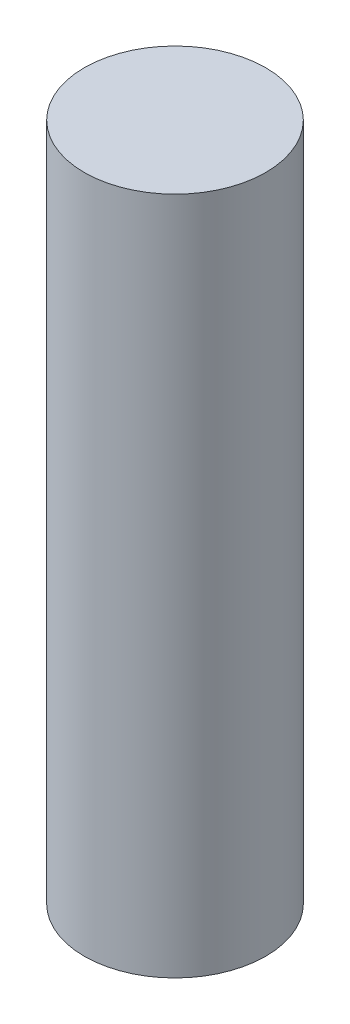
ISO-10303-21;
HEADER;
FILE_DESCRIPTION(('STEP AP214'),'2;1');
FILE_NAME('part.step','',(''),(''),'','','');
FILE_SCHEMA(('AUTOMOTIVE_DESIGN { 1 0 10303 214 1 1 1 1 }'));
ENDSEC;
DATA;
#1=APPLICATION_CONTEXT('core data for automotive mechanical design processes');
#2=APPLICATION_PROTOCOL_DEFINITION('international standard','automotive_design',2000,#1);
#3=PRODUCT_CONTEXT('',#1,'mechanical');
#4=PRODUCT('Part','Part','',(#3));
#5=PRODUCT_RELATED_PRODUCT_CATEGORY('part','',(#4));
#6=PRODUCT_DEFINITION_FORMATION('','',#4);
#7=PRODUCT_DEFINITION_CONTEXT('part definition',#1,'design');
#8=PRODUCT_DEFINITION('design','',#6,#7);
#9=PRODUCT_DEFINITION_SHAPE('','',#8);
#10=(LENGTH_UNIT() NAMED_UNIT(*) SI_UNIT(.MILLI.,.METRE.));
#11=(NAMED_UNIT(*) PLANE_ANGLE_UNIT() SI_UNIT($,.RADIAN.));
#12=(NAMED_UNIT(*) SI_UNIT($,.STERADIAN.) SOLID_ANGLE_UNIT());
#13=UNCERTAINTY_MEASURE_WITH_UNIT(LENGTH_MEASURE(1.E-05),#10,'distance_accuracy_value','');
#14=(GEOMETRIC_REPRESENTATION_CONTEXT(3) GLOBAL_UNCERTAINTY_ASSIGNED_CONTEXT((#13)) GLOBAL_UNIT_ASSIGNED_CONTEXT((#10,
#11,#12)) REPRESENTATION_CONTEXT('',''));
#15=CARTESIAN_POINT('',(0.,0.,0.));
#16=DIRECTION('',(0.,0.,1.));
#17=DIRECTION('',(1.,0.,0.));
#18=AXIS2_PLACEMENT_3D('',#15,#16,#17);
#19=CARTESIAN_POINT('',(0.,7.48,0.));
#20=DIRECTION('',(0.,-1.,0.));
#21=DIRECTION('',(0.,0.,-1.));
#22=AXIS2_PLACEMENT_3D('',#19,#20,#21);
#23=CYLINDRICAL_SURFACE('',#22,1.);
#24=CARTESIAN_POINT('',(0.,7.48,0.));
#25=DIRECTION('',(0.,1.,0.));
#26=DIRECTION('',(0.,0.,1.));
#27=AXIS2_PLACEMENT_3D('',#24,#25,#26);
#28=CIRCLE('',#27,1.);
#29=CARTESIAN_POINT('',(0.,7.48,1.));
#30=VERTEX_POINT('',#29);
#31=EDGE_CURVE('E10',#30,#30,#28,.T.);
#32=ORIENTED_EDGE('',*,*,#31,.F.);
#33=EDGE_LOOP('',(#32));
#34=FACE_BOUND('',#33,.T.);
#35=CARTESIAN_POINT('',(0.,0.,0.));
#36=DIRECTION('',(0.,1.,0.));
#37=DIRECTION('',(0.,0.,1.));
#38=AXIS2_PLACEMENT_3D('',#35,#36,#37);
#39=CIRCLE('',#38,1.);
#40=CARTESIAN_POINT('',(0.,0.,1.));
#41=VERTEX_POINT('',#40);
#42=EDGE_CURVE('E42',#41,#41,#39,.T.);
#43=ORIENTED_EDGE('',*,*,#42,.T.);
#44=EDGE_LOOP('',(#43));
#45=FACE_BOUND('',#44,.T.);
#46=ADVANCED_FACE('F39',(#34,#45),#23,.T.);
#47=CARTESIAN_POINT('',(0.,7.48,0.));
#48=DIRECTION('',(0.,1.,0.));
#49=DIRECTION('',(0.,0.,1.));
#50=AXIS2_PLACEMENT_3D('',#47,#48,#49);
#51=PLANE('',#50);
#52=ORIENTED_EDGE('',*,*,#31,.T.);
#53=EDGE_LOOP('',(#52));
#54=FACE_BOUND('',#53,.T.);
#55=ADVANCED_FACE('F54',(#54),#51,.T.);
#56=CARTESIAN_POINT('',(0.,0.,0.));
#57=DIRECTION('',(0.,1.,0.));
#58=DIRECTION('',(0.,0.,1.));
#59=AXIS2_PLACEMENT_3D('',#56,#57,#58);
#60=PLANE('',#59);
#61=ORIENTED_EDGE('',*,*,#42,.F.);
#62=EDGE_LOOP('',(#61));
#63=FACE_BOUND('',#62,.T.);
#64=ADVANCED_FACE('F52',(#63),#60,.F.);
#65=CLOSED_SHELL('',(#46,#55,#64));
#66=MANIFOLD_SOLID_BREP('B2',#65);
#67=ADVANCED_BREP_SHAPE_REPRESENTATION('',(#18,#66),#14);
#68=SHAPE_DEFINITION_REPRESENTATION(#9,#67);
ENDSEC;
END-ISO-10303-21;
